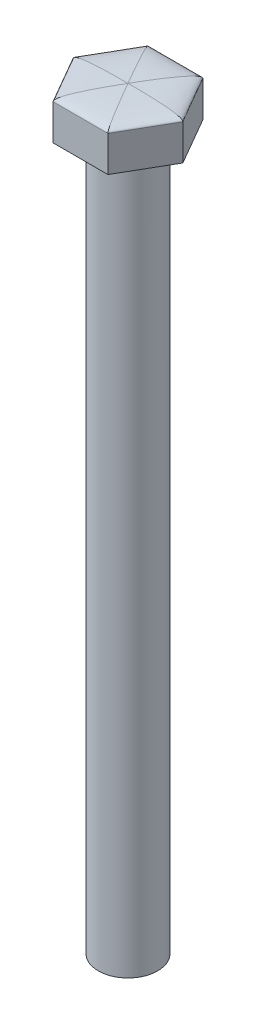
ISO-10303-21;
HEADER;
FILE_DESCRIPTION(('STEP AP214'),'2;1');
FILE_NAME('part.step','',(''),(''),'','','');
FILE_SCHEMA(('AUTOMOTIVE_DESIGN { 1 0 10303 214 1 1 1 1 }'));
ENDSEC;
DATA;
#1=APPLICATION_CONTEXT('core data for automotive mechanical design processes');
#2=APPLICATION_PROTOCOL_DEFINITION('international standard','automotive_design',2000,#1);
#3=PRODUCT_CONTEXT('',#1,'mechanical');
#4=PRODUCT('Part','Part','',(#3));
#5=PRODUCT_RELATED_PRODUCT_CATEGORY('part','',(#4));
#6=PRODUCT_DEFINITION_FORMATION('','',#4);
#7=PRODUCT_DEFINITION_CONTEXT('part definition',#1,'design');
#8=PRODUCT_DEFINITION('design','',#6,#7);
#9=PRODUCT_DEFINITION_SHAPE('','',#8);
#10=(LENGTH_UNIT() NAMED_UNIT(*) SI_UNIT(.MILLI.,.METRE.));
#11=(NAMED_UNIT(*) PLANE_ANGLE_UNIT() SI_UNIT($,.RADIAN.));
#12=(NAMED_UNIT(*) SI_UNIT($,.STERADIAN.) SOLID_ANGLE_UNIT());
#13=UNCERTAINTY_MEASURE_WITH_UNIT(LENGTH_MEASURE(1.E-05),#10,'distance_accuracy_value','');
#14=(GEOMETRIC_REPRESENTATION_CONTEXT(3) GLOBAL_UNCERTAINTY_ASSIGNED_CONTEXT((#13)) GLOBAL_UNIT_ASSIGNED_CONTEXT((#10,
#11,#12)) REPRESENTATION_CONTEXT('',''));
#15=CARTESIAN_POINT('',(0.,0.,0.));
#16=DIRECTION('',(0.,0.,1.));
#17=DIRECTION('',(1.,0.,0.));
#18=AXIS2_PLACEMENT_3D('',#15,#16,#17);
#19=CARTESIAN_POINT('',(2.30940107675854,3.,3.99999999999996));
#20=DIRECTION('',(-0.866025403784441,0.,-0.499999999999995));
#21=DIRECTION('',(-0.499999999999995,0.,0.866025403784442));
#22=AXIS2_PLACEMENT_3D('',#19,#20,#21);
#23=PLANE('',#22);
#24=DIRECTION('',(0.499999999999995,0.,-0.866025403784442));
#25=VECTOR('',#24,1.);
#26=CARTESIAN_POINT('',(2.30940107675854,0.,3.99999999999996));
#27=LINE('',#26,#25);
#28=CARTESIAN_POINT('',(2.30940107675854,0.,3.99999999999996));
#29=VERTEX_POINT('',#28);
#30=CARTESIAN_POINT('',(4.61880215351699,0.,0.));
#31=VERTEX_POINT('',#30);
#32=EDGE_CURVE('E151',#29,#31,#27,.T.);
#33=ORIENTED_EDGE('',*,*,#32,.T.);
#34=DIRECTION('',(0.,-1.,0.));
#35=VECTOR('',#34,1.);
#36=CARTESIAN_POINT('',(4.61880215351699,3.,0.));
#37=LINE('',#36,#35);
#38=CARTESIAN_POINT('',(4.61880215351699,3.,0.));
#39=VERTEX_POINT('',#38);
#40=EDGE_CURVE('E42',#39,#31,#37,.T.);
#41=ORIENTED_EDGE('',*,*,#40,.F.);
#42=DIRECTION('',(0.499999999999995,0.,-0.866025403784442));
#43=VECTOR('',#42,1.);
#44=CARTESIAN_POINT('',(2.30940107675854,3.,3.99999999999996));
#45=LINE('',#44,#43);
#46=CARTESIAN_POINT('',(2.30940107675854,3.,3.99999999999996));
#47=VERTEX_POINT('',#46);
#48=EDGE_CURVE('E152',#47,#39,#45,.T.);
#49=ORIENTED_EDGE('',*,*,#48,.F.);
#50=DIRECTION('',(0.,-1.,0.));
#51=VECTOR('',#50,1.);
#52=CARTESIAN_POINT('',(2.30940107675854,3.,3.99999999999996));
#53=LINE('',#52,#51);
#54=EDGE_CURVE('E164',#47,#29,#53,.T.);
#55=ORIENTED_EDGE('',*,*,#54,.T.);
#56=EDGE_LOOP('',(#33,#41,#49,#55));
#57=FACE_BOUND('',#56,.T.);
#58=ADVANCED_FACE('F34',(#57),#23,.F.);
#59=CARTESIAN_POINT('',(4.61880215351699,3.,0.));
#60=DIRECTION('',(-0.866025403784438,0.,0.500000000000001));
#61=DIRECTION('',(0.500000000000001,0.,0.866025403784438));
#62=AXIS2_PLACEMENT_3D('',#59,#60,#61);
#63=PLANE('',#62);
#64=DIRECTION('',(-0.500000000000001,0.,-0.866025403784438));
#65=VECTOR('',#64,1.);
#66=CARTESIAN_POINT('',(4.61880215351699,0.,0.));
#67=LINE('',#66,#65);
#68=CARTESIAN_POINT('',(2.30940107675849,0.,-3.99999999999999));
#69=VERTEX_POINT('',#68);
#70=EDGE_CURVE('E167',#31,#69,#67,.T.);
#71=ORIENTED_EDGE('',*,*,#70,.T.);
#72=DIRECTION('',(0.,-1.,0.));
#73=VECTOR('',#72,1.);
#74=CARTESIAN_POINT('',(2.30940107675849,3.,-3.99999999999999));
#75=LINE('',#74,#73);
#76=CARTESIAN_POINT('',(2.30940107675849,3.,-3.99999999999999));
#77=VERTEX_POINT('',#76);
#78=EDGE_CURVE('E106',#77,#69,#75,.T.);
#79=ORIENTED_EDGE('',*,*,#78,.F.);
#80=DIRECTION('',(-0.500000000000001,0.,-0.866025403784438));
#81=VECTOR('',#80,1.);
#82=CARTESIAN_POINT('',(4.61880215351699,3.,0.));
#83=LINE('',#82,#81);
#84=EDGE_CURVE('E87',#39,#77,#83,.T.);
#85=ORIENTED_EDGE('',*,*,#84,.F.);
#86=ORIENTED_EDGE('',*,*,#40,.T.);
#87=EDGE_LOOP('',(#71,#79,#85,#86));
#88=FACE_BOUND('',#87,.T.);
#89=ADVANCED_FACE('F177',(#88),#63,.F.);
#90=CARTESIAN_POINT('',(2.30940107675849,3.,-3.99999999999999));
#91=DIRECTION('',(0.,0.,1.));
#92=DIRECTION('',(1.,0.,0.));
#93=AXIS2_PLACEMENT_3D('',#90,#91,#92);
#94=PLANE('',#93);
#95=DIRECTION('',(-1.,0.,0.));
#96=VECTOR('',#95,1.);
#97=CARTESIAN_POINT('',(2.30940107675849,0.,-3.99999999999999));
#98=LINE('',#97,#96);
#99=CARTESIAN_POINT('',(-2.30940107675851,0.,-3.99999999999997));
#100=VERTEX_POINT('',#99);
#101=EDGE_CURVE('E103',#69,#100,#98,.T.);
#102=ORIENTED_EDGE('',*,*,#101,.T.);
#103=DIRECTION('',(0.,-1.,0.));
#104=VECTOR('',#103,1.);
#105=CARTESIAN_POINT('',(-2.30940107675851,3.,-3.99999999999997));
#106=LINE('',#105,#104);
#107=CARTESIAN_POINT('',(-2.30940107675851,3.,-3.99999999999997));
#108=VERTEX_POINT('',#107);
#109=EDGE_CURVE('E96',#108,#100,#106,.T.);
#110=ORIENTED_EDGE('',*,*,#109,.F.);
#111=DIRECTION('',(-1.,0.,0.));
#112=VECTOR('',#111,1.);
#113=CARTESIAN_POINT('',(2.30940107675849,3.,-3.99999999999999));
#114=LINE('',#113,#112);
#115=EDGE_CURVE('E101',#77,#108,#114,.T.);
#116=ORIENTED_EDGE('',*,*,#115,.F.);
#117=ORIENTED_EDGE('',*,*,#78,.T.);
#118=EDGE_LOOP('',(#102,#110,#116,#117));
#119=FACE_BOUND('',#118,.T.);
#120=ADVANCED_FACE('F98',(#119),#94,.F.);
#121=CARTESIAN_POINT('',(-2.30940107675851,3.,-3.99999999999997));
#122=DIRECTION('',(0.866025403784441,0.,0.499999999999995));
#123=DIRECTION('',(0.499999999999995,0.,-0.866025403784441));
#124=AXIS2_PLACEMENT_3D('',#121,#122,#123);
#125=PLANE('',#124);
#126=DIRECTION('',(-0.499999999999995,0.,0.866025403784441));
#127=VECTOR('',#126,1.);
#128=CARTESIAN_POINT('',(-2.30940107675851,0.,-3.99999999999997));
#129=LINE('',#128,#127);
#130=CARTESIAN_POINT('',(-4.61880215351699,0.,0.));
#131=VERTEX_POINT('',#130);
#132=EDGE_CURVE('E170',#100,#131,#129,.T.);
#133=ORIENTED_EDGE('',*,*,#132,.T.);
#134=DIRECTION('',(0.,-1.,0.));
#135=VECTOR('',#134,1.);
#136=CARTESIAN_POINT('',(-4.61880215351699,3.,0.));
#137=LINE('',#136,#135);
#138=CARTESIAN_POINT('',(-4.61880215351699,3.,0.));
#139=VERTEX_POINT('',#138);
#140=EDGE_CURVE('E107',#139,#131,#137,.T.);
#141=ORIENTED_EDGE('',*,*,#140,.F.);
#142=DIRECTION('',(-0.499999999999995,0.,0.866025403784441));
#143=VECTOR('',#142,1.);
#144=CARTESIAN_POINT('',(-2.30940107675851,3.,-3.99999999999997));
#145=LINE('',#144,#143);
#146=EDGE_CURVE('E110',#108,#139,#145,.T.);
#147=ORIENTED_EDGE('',*,*,#146,.F.);
#148=ORIENTED_EDGE('',*,*,#109,.T.);
#149=EDGE_LOOP('',(#133,#141,#147,#148));
#150=FACE_BOUND('',#149,.T.);
#151=ADVANCED_FACE('F111',(#150),#125,.F.);
#152=CARTESIAN_POINT('',(-4.61880215351699,3.,0.));
#153=DIRECTION('',(0.866025403784435,0.,-0.500000000000007));
#154=DIRECTION('',(-0.500000000000007,0.,-0.866025403784434));
#155=AXIS2_PLACEMENT_3D('',#152,#153,#154);
#156=PLANE('',#155);
#157=DIRECTION('',(0.500000000000007,0.,0.866025403784434));
#158=VECTOR('',#157,1.);
#159=CARTESIAN_POINT('',(-4.61880215351699,0.,0.));
#160=LINE('',#159,#158);
#161=CARTESIAN_POINT('',(-2.30940107675846,0.,4.00000000000001));
#162=VERTEX_POINT('',#161);
#163=EDGE_CURVE('E72',#131,#162,#160,.T.);
#164=ORIENTED_EDGE('',*,*,#163,.T.);
#165=DIRECTION('',(0.,-1.,0.));
#166=VECTOR('',#165,1.);
#167=CARTESIAN_POINT('',(-2.30940107675846,3.,4.00000000000001));
#168=LINE('',#167,#166);
#169=CARTESIAN_POINT('',(-2.30940107675846,3.,4.00000000000001));
#170=VERTEX_POINT('',#169);
#171=EDGE_CURVE('E50',#170,#162,#168,.T.);
#172=ORIENTED_EDGE('',*,*,#171,.F.);
#173=DIRECTION('',(0.500000000000007,0.,0.866025403784434));
#174=VECTOR('',#173,1.);
#175=CARTESIAN_POINT('',(-4.61880215351699,3.,0.));
#176=LINE('',#175,#174);
#177=EDGE_CURVE('E116',#139,#170,#176,.T.);
#178=ORIENTED_EDGE('',*,*,#177,.F.);
#179=ORIENTED_EDGE('',*,*,#140,.T.);
#180=EDGE_LOOP('',(#164,#172,#178,#179));
#181=FACE_BOUND('',#180,.T.);
#182=ADVANCED_FACE('F183',(#181),#156,.F.);
#183=CARTESIAN_POINT('',(-2.30940107675846,3.,4.00000000000001));
#184=DIRECTION('',(0.,0.,-1.));
#185=DIRECTION('',(-1.,0.,0.));
#186=AXIS2_PLACEMENT_3D('',#183,#184,#185);
#187=PLANE('',#186);
#188=DIRECTION('',(1.,0.,0.));
#189=VECTOR('',#188,1.);
#190=CARTESIAN_POINT('',(-2.30940107675846,0.,4.00000000000001));
#191=LINE('',#190,#189);
#192=EDGE_CURVE('E78',#162,#29,#191,.T.);
#193=ORIENTED_EDGE('',*,*,#192,.T.);
#194=ORIENTED_EDGE('',*,*,#54,.F.);
#195=DIRECTION('',(1.,0.,0.));
#196=VECTOR('',#195,1.);
#197=CARTESIAN_POINT('',(-2.30940107675846,3.,4.00000000000001));
#198=LINE('',#197,#196);
#199=EDGE_CURVE('E161',#170,#47,#198,.T.);
#200=ORIENTED_EDGE('',*,*,#199,.F.);
#201=ORIENTED_EDGE('',*,*,#171,.T.);
#202=EDGE_LOOP('',(#193,#194,#200,#201));
#203=FACE_BOUND('',#202,.T.);
#204=ADVANCED_FACE('F224',(#203),#187,.F.);
#205=CARTESIAN_POINT('',(0.,0.,0.));
#206=DIRECTION('',(0.,1.,0.));
#207=DIRECTION('',(0.,0.,1.));
#208=AXIS2_PLACEMENT_3D('',#205,#206,#207);
#209=PLANE('',#208);
#210=CARTESIAN_POINT('',(0.,0.,0.));
#211=DIRECTION('',(0.,1.,0.));
#212=DIRECTION('',(0.,0.,1.));
#213=AXIS2_PLACEMENT_3D('',#210,#211,#212);
#214=CIRCLE('',#213,2.5);
#215=CARTESIAN_POINT('',(0.,0.,2.5));
#216=VERTEX_POINT('',#215);
#217=EDGE_CURVE('E11',#216,#216,#214,.F.);
#218=ORIENTED_EDGE('',*,*,#217,.F.);
#219=EDGE_LOOP('',(#218));
#220=FACE_BOUND('',#219,.T.);
#221=ORIENTED_EDGE('',*,*,#32,.F.);
#222=ORIENTED_EDGE('',*,*,#192,.F.);
#223=ORIENTED_EDGE('',*,*,#163,.F.);
#224=ORIENTED_EDGE('',*,*,#132,.F.);
#225=ORIENTED_EDGE('',*,*,#101,.F.);
#226=ORIENTED_EDGE('',*,*,#70,.F.);
#227=EDGE_LOOP('',(#221,#222,#223,#224,#225,#226));
#228=FACE_BOUND('',#227,.T.);
#229=ADVANCED_FACE('F182',(#220,#228),#209,.F.);
#230=CARTESIAN_POINT('',(2.30940107675854,3.,3.99999999999996));
#231=CARTESIAN_POINT('',(2.30940107675854,3.5,3.99999999999996));
#232=CARTESIAN_POINT('',(0.,3.5,0.));
#233=CARTESIAN_POINT('',(4.61880215351699,3.,0.));
#234=CARTESIAN_POINT('',(4.61880215351699,3.5,0.));
#235=CARTESIAN_POINT('',(0.,3.5,0.));
#236=(BOUNDED_SURFACE() B_SPLINE_SURFACE(1,2,((#230,#231,#232),(#233,#234,#235)),.UNSPECIFIED.,
.F.,.F.,.F.) B_SPLINE_SURFACE_WITH_KNOTS((2,2),(3,3),(0.,1.),(0.,1.),
.UNSPECIFIED.) GEOMETRIC_REPRESENTATION_ITEM() RATIONAL_B_SPLINE_SURFACE(((1.,1.,1.),(1.,1.,1.))) REPRESENTATION_ITEM('') SURFACE());
#237=CARTESIAN_POINT('',(4.61880215351699,3.,0.));
#238=CARTESIAN_POINT('',(4.61880215351699,3.5,0.));
#239=CARTESIAN_POINT('',(0.,3.5,0.));
#240=(BOUNDED_CURVE() B_SPLINE_CURVE(2,(#237,#238,#239),.UNSPECIFIED.,.F.,
.F.) B_SPLINE_CURVE_WITH_KNOTS((3,3),(0.,1.),
.UNSPECIFIED.) CURVE() GEOMETRIC_REPRESENTATION_ITEM() RATIONAL_B_SPLINE_CURVE((1.,1.,1.)) REPRESENTATION_ITEM(''));
#241=CARTESIAN_POINT('',(0.,3.5,0.));
#242=VERTEX_POINT('',#241);
#243=EDGE_CURVE('E132',#39,#242,#240,.T.);
#244=CARTESIAN_POINT('',(2.30940107675854,3.,3.99999999999996));
#245=CARTESIAN_POINT('',(2.30940107675854,3.5,3.99999999999996));
#246=CARTESIAN_POINT('',(0.,3.5,0.));
#247=(BOUNDED_CURVE() B_SPLINE_CURVE(2,(#244,#245,#246),.UNSPECIFIED.,.F.,
.F.) B_SPLINE_CURVE_WITH_KNOTS((3,3),(0.,1.),
.UNSPECIFIED.) CURVE() GEOMETRIC_REPRESENTATION_ITEM() RATIONAL_B_SPLINE_CURVE((1.,1.,1.)) REPRESENTATION_ITEM(''));
#248=EDGE_CURVE('E192',#242,#47,#247,.F.);
#249=ORIENTED_EDGE('',*,*,#48,.T.);
#250=ORIENTED_EDGE('',*,*,#243,.T.);
#251=ORIENTED_EDGE('',*,*,#248,.T.);
#252=EDGE_LOOP('',(#249,#250,#251));
#253=FACE_BOUND('',#252,.T.);
#254=ADVANCED_FACE('F197',(#253),#236,.T.);
#255=CARTESIAN_POINT('',(4.61880215351699,3.,0.));
#256=CARTESIAN_POINT('',(4.61880215351699,3.5,0.));
#257=CARTESIAN_POINT('',(0.,3.5,0.));
#258=CARTESIAN_POINT('',(2.30940107675849,3.,-3.99999999999999));
#259=CARTESIAN_POINT('',(2.30940107675849,3.5,-3.99999999999999));
#260=CARTESIAN_POINT('',(0.,3.5,0.));
#261=(BOUNDED_SURFACE() B_SPLINE_SURFACE(1,2,((#255,#256,#257),(#258,#259,#260)),.UNSPECIFIED.,
.F.,.F.,.F.) B_SPLINE_SURFACE_WITH_KNOTS((2,2),(3,3),(0.,1.),(0.,1.),
.UNSPECIFIED.) GEOMETRIC_REPRESENTATION_ITEM() RATIONAL_B_SPLINE_SURFACE(((1.,1.,1.),(1.,1.,1.))) REPRESENTATION_ITEM('') SURFACE());
#262=CARTESIAN_POINT('',(2.30940107675849,3.,-3.99999999999999));
#263=CARTESIAN_POINT('',(2.30940107675849,3.5,-3.99999999999999));
#264=CARTESIAN_POINT('',(0.,3.5,0.));
#265=(BOUNDED_CURVE() B_SPLINE_CURVE(2,(#262,#263,#264),.UNSPECIFIED.,.F.,
.F.) B_SPLINE_CURVE_WITH_KNOTS((3,3),(0.,1.),
.UNSPECIFIED.) CURVE() GEOMETRIC_REPRESENTATION_ITEM() RATIONAL_B_SPLINE_CURVE((1.,1.,1.)) REPRESENTATION_ITEM(''));
#266=EDGE_CURVE('E124',#77,#242,#265,.T.);
#267=ORIENTED_EDGE('',*,*,#84,.T.);
#268=ORIENTED_EDGE('',*,*,#266,.T.);
#269=ORIENTED_EDGE('',*,*,#243,.F.);
#270=EDGE_LOOP('',(#267,#268,#269));
#271=FACE_BOUND('',#270,.T.);
#272=ADVANCED_FACE('F200',(#271),#261,.T.);
#273=CARTESIAN_POINT('',(-2.30940107675846,3.,4.00000000000001));
#274=CARTESIAN_POINT('',(-2.30940107675846,3.5,4.00000000000001));
#275=CARTESIAN_POINT('',(0.,3.5,0.));
#276=CARTESIAN_POINT('',(2.30940107675854,3.,3.99999999999996));
#277=CARTESIAN_POINT('',(2.30940107675854,3.5,3.99999999999996));
#278=CARTESIAN_POINT('',(0.,3.5,0.));
#279=(BOUNDED_SURFACE() B_SPLINE_SURFACE(1,2,((#273,#274,#275),(#276,#277,#278)),.UNSPECIFIED.,
.F.,.F.,.F.) B_SPLINE_SURFACE_WITH_KNOTS((2,2),(3,3),(0.,1.),(0.,1.),
.UNSPECIFIED.) GEOMETRIC_REPRESENTATION_ITEM() RATIONAL_B_SPLINE_SURFACE(((1.,1.,1.),(1.,1.,1.))) REPRESENTATION_ITEM('') SURFACE());
#280=CARTESIAN_POINT('',(-2.30940107675846,3.,4.00000000000001));
#281=CARTESIAN_POINT('',(-2.30940107675846,3.5,4.00000000000001));
#282=CARTESIAN_POINT('',(0.,3.5,0.));
#283=(BOUNDED_CURVE() B_SPLINE_CURVE(2,(#280,#281,#282),.UNSPECIFIED.,.F.,
.F.) B_SPLINE_CURVE_WITH_KNOTS((3,3),(0.,1.),
.UNSPECIFIED.) CURVE() GEOMETRIC_REPRESENTATION_ITEM() RATIONAL_B_SPLINE_CURVE((1.,1.,1.)) REPRESENTATION_ITEM(''));
#284=EDGE_CURVE('E130',#170,#242,#283,.T.);
#285=ORIENTED_EDGE('',*,*,#199,.T.);
#286=ORIENTED_EDGE('',*,*,#248,.F.);
#287=ORIENTED_EDGE('',*,*,#284,.F.);
#288=EDGE_LOOP('',(#285,#286,#287));
#289=FACE_BOUND('',#288,.T.);
#290=ADVANCED_FACE('F189',(#289),#279,.T.);
#291=CARTESIAN_POINT('',(2.30940107675849,3.,-3.99999999999999));
#292=CARTESIAN_POINT('',(2.30940107675849,3.5,-3.99999999999999));
#293=CARTESIAN_POINT('',(0.,3.5,0.));
#294=CARTESIAN_POINT('',(-2.30940107675851,3.,-3.99999999999997));
#295=CARTESIAN_POINT('',(-2.30940107675851,3.5,-3.99999999999997));
#296=CARTESIAN_POINT('',(0.,3.5,0.));
#297=(BOUNDED_SURFACE() B_SPLINE_SURFACE(1,2,((#291,#292,#293),(#294,#295,#296)),.UNSPECIFIED.,
.F.,.F.,.F.) B_SPLINE_SURFACE_WITH_KNOTS((2,2),(3,3),(0.,1.),(0.,1.),
.UNSPECIFIED.) GEOMETRIC_REPRESENTATION_ITEM() RATIONAL_B_SPLINE_SURFACE(((1.,1.,1.),(1.,1.,1.))) REPRESENTATION_ITEM('') SURFACE());
#298=CARTESIAN_POINT('',(-2.30940107675851,3.,-3.99999999999997));
#299=CARTESIAN_POINT('',(-2.30940107675851,3.5,-3.99999999999997));
#300=CARTESIAN_POINT('',(0.,3.5,0.));
#301=(BOUNDED_CURVE() B_SPLINE_CURVE(2,(#298,#299,#300),.UNSPECIFIED.,.F.,
.F.) B_SPLINE_CURVE_WITH_KNOTS((3,3),(0.,1.),
.UNSPECIFIED.) CURVE() GEOMETRIC_REPRESENTATION_ITEM() RATIONAL_B_SPLINE_CURVE((1.,1.,1.)) REPRESENTATION_ITEM(''));
#302=EDGE_CURVE('E122',#108,#242,#301,.T.);
#303=ORIENTED_EDGE('',*,*,#115,.T.);
#304=ORIENTED_EDGE('',*,*,#302,.T.);
#305=ORIENTED_EDGE('',*,*,#266,.F.);
#306=EDGE_LOOP('',(#303,#304,#305));
#307=FACE_BOUND('',#306,.T.);
#308=ADVANCED_FACE('F121',(#307),#297,.T.);
#309=CARTESIAN_POINT('',(-2.30940107675851,3.,-3.99999999999997));
#310=CARTESIAN_POINT('',(-2.30940107675851,3.5,-3.99999999999997));
#311=CARTESIAN_POINT('',(0.,3.5,0.));
#312=CARTESIAN_POINT('',(-4.61880215351699,3.,0.));
#313=CARTESIAN_POINT('',(-4.61880215351699,3.5,0.));
#314=CARTESIAN_POINT('',(0.,3.5,0.));
#315=(BOUNDED_SURFACE() B_SPLINE_SURFACE(1,2,((#309,#310,#311),(#312,#313,#314)),.UNSPECIFIED.,
.F.,.F.,.F.) B_SPLINE_SURFACE_WITH_KNOTS((2,2),(3,3),(0.,1.),(0.,1.),
.UNSPECIFIED.) GEOMETRIC_REPRESENTATION_ITEM() RATIONAL_B_SPLINE_SURFACE(((1.,1.,1.),(1.,1.,1.))) REPRESENTATION_ITEM('') SURFACE());
#316=CARTESIAN_POINT('',(-4.61880215351699,3.,0.));
#317=CARTESIAN_POINT('',(-4.61880215351699,3.5,0.));
#318=CARTESIAN_POINT('',(0.,3.5,0.));
#319=(BOUNDED_CURVE() B_SPLINE_CURVE(2,(#316,#317,#318),.UNSPECIFIED.,.F.,
.F.) B_SPLINE_CURVE_WITH_KNOTS((3,3),(0.,1.),
.UNSPECIFIED.) CURVE() GEOMETRIC_REPRESENTATION_ITEM() RATIONAL_B_SPLINE_CURVE((1.,1.,1.)) REPRESENTATION_ITEM(''));
#320=EDGE_CURVE('E127',#139,#242,#319,.T.);
#321=ORIENTED_EDGE('',*,*,#146,.T.);
#322=ORIENTED_EDGE('',*,*,#320,.T.);
#323=ORIENTED_EDGE('',*,*,#302,.F.);
#324=EDGE_LOOP('',(#321,#322,#323));
#325=FACE_BOUND('',#324,.T.);
#326=ADVANCED_FACE('F126',(#325),#315,.T.);
#327=CARTESIAN_POINT('',(-4.61880215351699,3.,0.));
#328=CARTESIAN_POINT('',(-4.61880215351699,3.5,0.));
#329=CARTESIAN_POINT('',(0.,3.5,0.));
#330=CARTESIAN_POINT('',(-2.30940107675846,3.,4.00000000000001));
#331=CARTESIAN_POINT('',(-2.30940107675846,3.5,4.00000000000001));
#332=CARTESIAN_POINT('',(0.,3.5,0.));
#333=(BOUNDED_SURFACE() B_SPLINE_SURFACE(1,2,((#327,#328,#329),(#330,#331,#332)),.UNSPECIFIED.,
.F.,.F.,.F.) B_SPLINE_SURFACE_WITH_KNOTS((2,2),(3,3),(0.,1.),(0.,1.),
.UNSPECIFIED.) GEOMETRIC_REPRESENTATION_ITEM() RATIONAL_B_SPLINE_SURFACE(((1.,1.,1.),(1.,1.,1.))) REPRESENTATION_ITEM('') SURFACE());
#334=ORIENTED_EDGE('',*,*,#177,.T.);
#335=ORIENTED_EDGE('',*,*,#284,.T.);
#336=ORIENTED_EDGE('',*,*,#320,.F.);
#337=EDGE_LOOP('',(#334,#335,#336));
#338=FACE_BOUND('',#337,.T.);
#339=ADVANCED_FACE('F186',(#338),#333,.T.);
#340=CARTESIAN_POINT('',(0.,-60.,0.));
#341=DIRECTION('',(0.,1.,0.));
#342=DIRECTION('',(0.,0.,1.));
#343=AXIS2_PLACEMENT_3D('',#340,#341,#342);
#344=CYLINDRICAL_SURFACE('',#343,2.5);
#345=CARTESIAN_POINT('',(0.,-60.,0.));
#346=DIRECTION('',(0.,-1.,0.));
#347=DIRECTION('',(0.,0.,-1.));
#348=AXIS2_PLACEMENT_3D('',#345,#346,#347);
#349=CIRCLE('',#348,2.5);
#350=CARTESIAN_POINT('',(0.,-60.,-2.5));
#351=VERTEX_POINT('',#350);
#352=EDGE_CURVE('E195',#351,#351,#349,.T.);
#353=ORIENTED_EDGE('',*,*,#352,.F.);
#354=EDGE_LOOP('',(#353));
#355=FACE_BOUND('',#354,.T.);
#356=ORIENTED_EDGE('',*,*,#217,.T.);
#357=EDGE_LOOP('',(#356));
#358=FACE_BOUND('',#357,.T.);
#359=ADVANCED_FACE('F234',(#355,#358),#344,.T.);
#360=CARTESIAN_POINT('',(0.,-60.,0.));
#361=DIRECTION('',(0.,-1.,0.));
#362=DIRECTION('',(0.,0.,-1.));
#363=AXIS2_PLACEMENT_3D('',#360,#361,#362);
#364=PLANE('',#363);
#365=ORIENTED_EDGE('',*,*,#352,.T.);
#366=EDGE_LOOP('',(#365));
#367=FACE_BOUND('',#366,.T.);
#368=ADVANCED_FACE('F284',(#367),#364,.T.);
#369=CLOSED_SHELL('',(#58,#89,#120,#151,#182,#204,#229,#254,#272,#290,#308,#326,#339,#359,#368));
#370=MANIFOLD_SOLID_BREP('B2',#369);
#371=ADVANCED_BREP_SHAPE_REPRESENTATION('',(#18,#370),#14);
#372=SHAPE_DEFINITION_REPRESENTATION(#9,#371);
ENDSEC;
END-ISO-10303-21;
